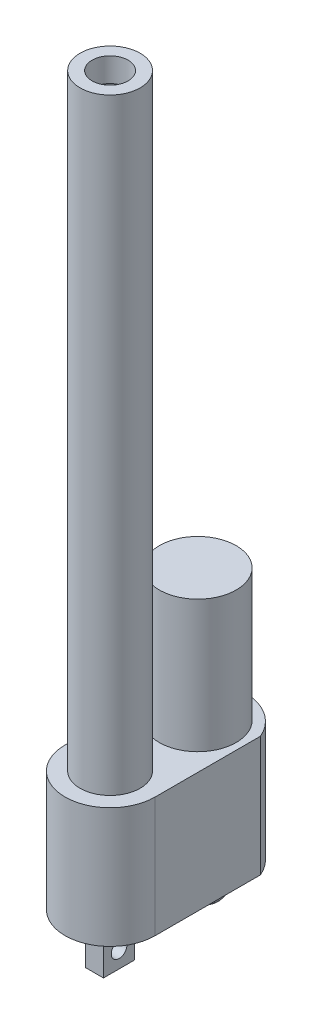
ISO-10303-21;
HEADER;
FILE_DESCRIPTION(('STEP AP214'),'2;1');
FILE_NAME('part.step','',(''),(''),'','','');
FILE_SCHEMA(('AUTOMOTIVE_DESIGN { 1 0 10303 214 1 1 1 1 }'));
ENDSEC;
DATA;
#1=APPLICATION_CONTEXT('core data for automotive mechanical design processes');
#2=APPLICATION_PROTOCOL_DEFINITION('international standard','automotive_design',2000,#1);
#3=PRODUCT_CONTEXT('',#1,'mechanical');
#4=PRODUCT('Part','Part','',(#3));
#5=PRODUCT_RELATED_PRODUCT_CATEGORY('part','',(#4));
#6=PRODUCT_DEFINITION_FORMATION('','',#4);
#7=PRODUCT_DEFINITION_CONTEXT('part definition',#1,'design');
#8=PRODUCT_DEFINITION('design','',#6,#7);
#9=PRODUCT_DEFINITION_SHAPE('','',#8);
#10=(LENGTH_UNIT() NAMED_UNIT(*) SI_UNIT(.MILLI.,.METRE.));
#11=(NAMED_UNIT(*) PLANE_ANGLE_UNIT() SI_UNIT($,.RADIAN.));
#12=(NAMED_UNIT(*) SI_UNIT($,.STERADIAN.) SOLID_ANGLE_UNIT());
#13=UNCERTAINTY_MEASURE_WITH_UNIT(LENGTH_MEASURE(1.E-05),#10,'distance_accuracy_value','');
#14=(GEOMETRIC_REPRESENTATION_CONTEXT(3) GLOBAL_UNCERTAINTY_ASSIGNED_CONTEXT((#13)) GLOBAL_UNIT_ASSIGNED_CONTEXT((#10,
#11,#12)) REPRESENTATION_CONTEXT('',''));
#15=CARTESIAN_POINT('',(0.,0.,0.));
#16=DIRECTION('',(0.,0.,1.));
#17=DIRECTION('',(1.,0.,0.));
#18=AXIS2_PLACEMENT_3D('',#15,#16,#17);
#19=CARTESIAN_POINT('',(0.,505.,0.));
#20=DIRECTION('',(0.,1.,0.));
#21=DIRECTION('',(1.,0.,0.));
#22=AXIS2_PLACEMENT_3D('',#19,#20,#21);
#23=PLANE('',#22);
#24=CARTESIAN_POINT('',(0.,505.,0.));
#25=DIRECTION('',(0.,-1.,0.));
#26=DIRECTION('',(-1.,0.,0.));
#27=AXIS2_PLACEMENT_3D('',#24,#25,#26);
#28=CIRCLE('',#27,15.);
#29=CARTESIAN_POINT('',(15.,505.,0.));
#30=VERTEX_POINT('',#29);
#31=EDGE_CURVE('E284',#30,#30,#28,.T.);
#32=ORIENTED_EDGE('',*,*,#31,.T.);
#33=EDGE_LOOP('',(#32));
#34=FACE_BOUND('',#33,.T.);
#35=CARTESIAN_POINT('',(0.,505.,0.));
#36=DIRECTION('',(0.,1.,0.));
#37=DIRECTION('',(-1.,0.,0.));
#38=AXIS2_PLACEMENT_3D('',#35,#36,#37);
#39=CIRCLE('',#38,25.);
#40=CARTESIAN_POINT('',(25.,505.,0.));
#41=VERTEX_POINT('',#40);
#42=EDGE_CURVE('E28',#41,#41,#39,.T.);
#43=ORIENTED_EDGE('',*,*,#42,.T.);
#44=EDGE_LOOP('',(#43));
#45=FACE_BOUND('',#44,.T.);
#46=ADVANCED_FACE('F17',(#34,#45),#23,.T.);
#47=CARTESIAN_POINT('',(0.,0.,0.));
#48=DIRECTION('',(0.,1.,0.));
#49=DIRECTION('',(-1.,0.,0.));
#50=AXIS2_PLACEMENT_3D('',#47,#48,#49);
#51=CYLINDRICAL_SURFACE('',#50,25.);
#52=ORIENTED_EDGE('',*,*,#42,.F.);
#53=DIRECTION('',(0.,-1.,0.));
#54=VECTOR('',#53,1.);
#55=CARTESIAN_POINT('',(25.,0.,0.));
#56=LINE('',#55,#54);
#57=CARTESIAN_POINT('',(25.,0.,0.));
#58=VERTEX_POINT('',#57);
#59=EDGE_CURVE('E11',#41,#58,#56,.T.);
#60=ORIENTED_EDGE('',*,*,#59,.T.);
#61=CARTESIAN_POINT('',(0.,0.,0.));
#62=DIRECTION('',(0.,1.,0.));
#63=DIRECTION('',(-1.,0.,0.));
#64=AXIS2_PLACEMENT_3D('',#61,#62,#63);
#65=CIRCLE('',#64,25.);
#66=EDGE_CURVE('E227',#58,#58,#65,.T.);
#67=ORIENTED_EDGE('',*,*,#66,.T.);
#68=ORIENTED_EDGE('',*,*,#59,.F.);
#69=EDGE_LOOP('',(#52,#60,#67,#68));
#70=FACE_BOUND('',#69,.T.);
#71=ADVANCED_FACE('F654',(#70),#51,.T.);
#72=CARTESIAN_POINT('',(0.,0.,0.));
#73=DIRECTION('',(0.,1.,0.));
#74=DIRECTION('',(-1.,0.,0.));
#75=AXIS2_PLACEMENT_3D('',#72,#73,#74);
#76=CYLINDRICAL_SURFACE('',#75,20.);
#77=CARTESIAN_POINT('',(0.,0.,0.));
#78=DIRECTION('',(0.,1.,0.));
#79=DIRECTION('',(-1.,0.,0.));
#80=AXIS2_PLACEMENT_3D('',#77,#78,#79);
#81=CIRCLE('',#80,20.);
#82=CARTESIAN_POINT('',(20.,0.,0.));
#83=VERTEX_POINT('',#82);
#84=EDGE_CURVE('E221',#83,#83,#81,.T.);
#85=ORIENTED_EDGE('',*,*,#84,.F.);
#86=DIRECTION('',(0.,1.,0.));
#87=VECTOR('',#86,1.);
#88=CARTESIAN_POINT('',(20.,0.,0.));
#89=LINE('',#88,#87);
#90=CARTESIAN_POINT('',(20.,485.,0.));
#91=VERTEX_POINT('',#90);
#92=EDGE_CURVE('E204',#83,#91,#89,.T.);
#93=ORIENTED_EDGE('',*,*,#92,.T.);
#94=CARTESIAN_POINT('',(0.,485.,0.));
#95=DIRECTION('',(0.,1.,0.));
#96=DIRECTION('',(-1.,0.,0.));
#97=AXIS2_PLACEMENT_3D('',#94,#95,#96);
#98=CIRCLE('',#97,20.);
#99=EDGE_CURVE('E267',#91,#91,#98,.T.);
#100=ORIENTED_EDGE('',*,*,#99,.T.);
#101=ORIENTED_EDGE('',*,*,#92,.F.);
#102=EDGE_LOOP('',(#85,#93,#100,#101));
#103=FACE_BOUND('',#102,.T.);
#104=ADVANCED_FACE('F684',(#103),#76,.F.);
#105=CARTESIAN_POINT('',(0.,-100.,-37.5));
#106=DIRECTION('',(0.,-1.,0.));
#107=DIRECTION('',(0.,0.,-1.));
#108=AXIS2_PLACEMENT_3D('',#105,#106,#107);
#109=PLANE('',#108);
#110=CARTESIAN_POINT('',(0.,-100.,0.));
#111=DIRECTION('',(0.,1.,0.));
#112=DIRECTION('',(1.,0.,0.));
#113=AXIS2_PLACEMENT_3D('',#110,#111,#112);
#114=CIRCLE('',#113,15.);
#115=CARTESIAN_POINT('',(-15.,-100.,0.));
#116=VERTEX_POINT('',#115);
#117=EDGE_CURVE('E247',#116,#116,#114,.T.);
#118=ORIENTED_EDGE('',*,*,#117,.T.);
#119=EDGE_LOOP('',(#118));
#120=FACE_BOUND('',#119,.T.);
#121=CARTESIAN_POINT('',(0.,-100.,-78.2205334953049));
#122=DIRECTION('',(0.,1.,0.));
#123=DIRECTION('',(1.,0.,0.));
#124=AXIS2_PLACEMENT_3D('',#121,#122,#123);
#125=CIRCLE('',#124,15.);
#126=CARTESIAN_POINT('',(-15.,-100.,-78.2205334953049));
#127=VERTEX_POINT('',#126);
#128=EDGE_CURVE('E301',#127,#127,#125,.T.);
#129=ORIENTED_EDGE('',*,*,#128,.T.);
#130=EDGE_LOOP('',(#129));
#131=FACE_BOUND('',#130,.T.);
#132=CARTESIAN_POINT('',(0.,-100.,0.));
#133=DIRECTION('',(0.,-1.,0.));
#134=DIRECTION('',(1.,0.,0.));
#135=AXIS2_PLACEMENT_3D('',#132,#133,#134);
#136=CIRCLE('',#135,37.5);
#137=CARTESIAN_POINT('',(37.5,-100.,0.));
#138=VERTEX_POINT('',#137);
#139=CARTESIAN_POINT('',(-37.5,-100.,0.));
#140=VERTEX_POINT('',#139);
#141=EDGE_CURVE('E192',#138,#140,#136,.T.);
#142=ORIENTED_EDGE('',*,*,#141,.T.);
#143=DIRECTION('',(0.,0.,-1.));
#144=VECTOR('',#143,1.);
#145=CARTESIAN_POINT('',(-37.5,-100.,0.));
#146=LINE('',#145,#144);
#147=CARTESIAN_POINT('',(-37.5,-100.,-87.6893129809068));
#148=VERTEX_POINT('',#147);
#149=EDGE_CURVE('E324',#140,#148,#146,.T.);
#150=ORIENTED_EDGE('',*,*,#149,.T.);
#151=CARTESIAN_POINT('',(0.,-100.,-71.7550543077768));
#152=DIRECTION('',(0.,-1.,0.));
#153=DIRECTION('',(-0.920359552894371,0.,-0.391073258349474));
#154=AXIS2_PLACEMENT_3D('',#151,#152,#153);
#155=CIRCLE('',#154,40.7449456922232);
#156=CARTESIAN_POINT('',(37.5,-100.,-87.6893129809068));
#157=VERTEX_POINT('',#156);
#158=EDGE_CURVE('E210',#148,#157,#155,.T.);
#159=ORIENTED_EDGE('',*,*,#158,.T.);
#160=DIRECTION('',(0.,0.,1.));
#161=VECTOR('',#160,1.);
#162=CARTESIAN_POINT('',(37.5,-100.,-87.6893129809068));
#163=LINE('',#162,#161);
#164=EDGE_CURVE('E207',#157,#138,#163,.T.);
#165=ORIENTED_EDGE('',*,*,#164,.T.);
#166=EDGE_LOOP('',(#142,#150,#159,#165));
#167=FACE_BOUND('',#166,.T.);
#168=ADVANCED_FACE('F208',(#120,#131,#167),#109,.T.);
#169=CARTESIAN_POINT('',(0.,0.,0.));
#170=DIRECTION('',(0.,-1.,0.));
#171=DIRECTION('',(1.,0.,0.));
#172=AXIS2_PLACEMENT_3D('',#169,#170,#171);
#173=CYLINDRICAL_SURFACE('',#172,37.5);
#174=CARTESIAN_POINT('',(0.,0.,0.));
#175=DIRECTION('',(0.,-1.,0.));
#176=DIRECTION('',(1.,0.,0.));
#177=AXIS2_PLACEMENT_3D('',#174,#175,#176);
#178=CIRCLE('',#177,37.5);
#179=CARTESIAN_POINT('',(37.5,0.,0.));
#180=VERTEX_POINT('',#179);
#181=CARTESIAN_POINT('',(-37.5,0.,0.));
#182=VERTEX_POINT('',#181);
#183=EDGE_CURVE('E256',#180,#182,#178,.T.);
#184=ORIENTED_EDGE('',*,*,#183,.T.);
#185=DIRECTION('',(0.,-1.,0.));
#186=VECTOR('',#185,1.);
#187=CARTESIAN_POINT('',(-37.5,0.,0.));
#188=LINE('',#187,#186);
#189=EDGE_CURVE('E199',#182,#140,#188,.T.);
#190=ORIENTED_EDGE('',*,*,#189,.T.);
#191=ORIENTED_EDGE('',*,*,#141,.F.);
#192=DIRECTION('',(0.,-1.,0.));
#193=VECTOR('',#192,1.);
#194=CARTESIAN_POINT('',(37.5,0.,0.));
#195=LINE('',#194,#193);
#196=EDGE_CURVE('E197',#180,#138,#195,.T.);
#197=ORIENTED_EDGE('',*,*,#196,.F.);
#198=EDGE_LOOP('',(#184,#190,#191,#197));
#199=FACE_BOUND('',#198,.T.);
#200=ADVANCED_FACE('F195',(#199),#173,.T.);
#201=CARTESIAN_POINT('',(-37.5,0.,0.));
#202=DIRECTION('',(-1.,0.,0.));
#203=DIRECTION('',(0.,0.,1.));
#204=AXIS2_PLACEMENT_3D('',#201,#202,#203);
#205=PLANE('',#204);
#206=DIRECTION('',(0.,0.,-1.));
#207=VECTOR('',#206,1.);
#208=CARTESIAN_POINT('',(-37.5,0.,0.));
#209=LINE('',#208,#207);
#210=CARTESIAN_POINT('',(-37.5,0.,-87.6893129809068));
#211=VERTEX_POINT('',#210);
#212=EDGE_CURVE('E275',#182,#211,#209,.T.);
#213=ORIENTED_EDGE('',*,*,#212,.T.);
#214=DIRECTION('',(0.,-1.,0.));
#215=VECTOR('',#214,1.);
#216=CARTESIAN_POINT('',(-37.5,0.,-87.6893129809068));
#217=LINE('',#216,#215);
#218=EDGE_CURVE('E320',#211,#148,#217,.T.);
#219=ORIENTED_EDGE('',*,*,#218,.T.);
#220=ORIENTED_EDGE('',*,*,#149,.F.);
#221=ORIENTED_EDGE('',*,*,#189,.F.);
#222=EDGE_LOOP('',(#213,#219,#220,#221));
#223=FACE_BOUND('',#222,.T.);
#224=ADVANCED_FACE('F664',(#223),#205,.T.);
#225=CARTESIAN_POINT('',(0.,0.,-71.7550543077768));
#226=DIRECTION('',(0.,-1.,0.));
#227=DIRECTION('',(-0.920359552894371,0.,-0.391073258349474));
#228=AXIS2_PLACEMENT_3D('',#225,#226,#227);
#229=CYLINDRICAL_SURFACE('',#228,40.7449456922232);
#230=CARTESIAN_POINT('',(0.,0.,-71.7550543077768));
#231=DIRECTION('',(0.,-1.,0.));
#232=DIRECTION('',(-0.920359552894371,0.,-0.391073258349474));
#233=AXIS2_PLACEMENT_3D('',#230,#231,#232);
#234=CIRCLE('',#233,40.7449456922232);
#235=CARTESIAN_POINT('',(37.5,0.,-87.6893129809068));
#236=VERTEX_POINT('',#235);
#237=EDGE_CURVE('E279',#211,#236,#234,.T.);
#238=ORIENTED_EDGE('',*,*,#237,.T.);
#239=DIRECTION('',(0.,-1.,0.));
#240=VECTOR('',#239,1.);
#241=CARTESIAN_POINT('',(37.5,0.,-87.6893129809068));
#242=LINE('',#241,#240);
#243=EDGE_CURVE('E214',#236,#157,#242,.T.);
#244=ORIENTED_EDGE('',*,*,#243,.T.);
#245=ORIENTED_EDGE('',*,*,#158,.F.);
#246=ORIENTED_EDGE('',*,*,#218,.F.);
#247=EDGE_LOOP('',(#238,#244,#245,#246));
#248=FACE_BOUND('',#247,.T.);
#249=ADVANCED_FACE('F667',(#248),#229,.T.);
#250=CARTESIAN_POINT('',(37.5,0.,-87.6893129809068));
#251=DIRECTION('',(1.,0.,0.));
#252=DIRECTION('',(0.,1.,0.));
#253=AXIS2_PLACEMENT_3D('',#250,#251,#252);
#254=PLANE('',#253);
#255=DIRECTION('',(0.,0.,1.));
#256=VECTOR('',#255,1.);
#257=CARTESIAN_POINT('',(37.5,0.,-87.6893129809068));
#258=LINE('',#257,#256);
#259=EDGE_CURVE('E218',#236,#180,#258,.T.);
#260=ORIENTED_EDGE('',*,*,#259,.T.);
#261=ORIENTED_EDGE('',*,*,#196,.T.);
#262=ORIENTED_EDGE('',*,*,#164,.F.);
#263=ORIENTED_EDGE('',*,*,#243,.F.);
#264=EDGE_LOOP('',(#260,#261,#262,#263));
#265=FACE_BOUND('',#264,.T.);
#266=ADVANCED_FACE('F216',(#265),#254,.T.);
#267=CARTESIAN_POINT('',(0.,0.,-37.5));
#268=DIRECTION('',(0.,-1.,0.));
#269=DIRECTION('',(0.,0.,-1.));
#270=AXIS2_PLACEMENT_3D('',#267,#268,#269);
#271=PLANE('',#270);
#272=ORIENTED_EDGE('',*,*,#84,.T.);
#273=EDGE_LOOP('',(#272));
#274=FACE_BOUND('',#273,.T.);
#275=ADVANCED_FACE('F659',(#274),#271,.F.);
#276=CARTESIAN_POINT('',(0.,0.,-37.5));
#277=DIRECTION('',(0.,-1.,0.));
#278=DIRECTION('',(0.,0.,-1.));
#279=AXIS2_PLACEMENT_3D('',#276,#277,#278);
#280=PLANE('',#279);
#281=ORIENTED_EDGE('',*,*,#66,.F.);
#282=EDGE_LOOP('',(#281));
#283=FACE_BOUND('',#282,.T.);
#284=CARTESIAN_POINT('',(0.,0.,-72.9769138079016));
#285=DIRECTION('',(0.,-1.,0.));
#286=DIRECTION('',(1.,0.,0.));
#287=AXIS2_PLACEMENT_3D('',#284,#285,#286);
#288=CIRCLE('',#287,32.);
#289=CARTESIAN_POINT('',(-32.,0.,-72.9769138079016));
#290=VERTEX_POINT('',#289);
#291=EDGE_CURVE('E142',#290,#290,#288,.T.);
#292=ORIENTED_EDGE('',*,*,#291,.T.);
#293=EDGE_LOOP('',(#292));
#294=FACE_BOUND('',#293,.T.);
#295=ORIENTED_EDGE('',*,*,#183,.F.);
#296=ORIENTED_EDGE('',*,*,#259,.F.);
#297=ORIENTED_EDGE('',*,*,#237,.F.);
#298=ORIENTED_EDGE('',*,*,#212,.F.);
#299=EDGE_LOOP('',(#295,#296,#297,#298));
#300=FACE_BOUND('',#299,.T.);
#301=ADVANCED_FACE('F19',(#283,#294,#300),#280,.F.);
#302=CARTESIAN_POINT('',(0.,110.,-72.9769138079016));
#303=DIRECTION('',(0.,1.,0.));
#304=DIRECTION('',(1.,0.,0.));
#305=AXIS2_PLACEMENT_3D('',#302,#303,#304);
#306=PLANE('',#305);
#307=CARTESIAN_POINT('',(0.,110.,-72.9769138079016));
#308=DIRECTION('',(0.,1.,0.));
#309=DIRECTION('',(1.,0.,0.));
#310=AXIS2_PLACEMENT_3D('',#307,#308,#309);
#311=CIRCLE('',#310,32.);
#312=CARTESIAN_POINT('',(-32.,110.,-72.9769138079016));
#313=VERTEX_POINT('',#312);
#314=EDGE_CURVE('E250',#313,#313,#311,.T.);
#315=ORIENTED_EDGE('',*,*,#314,.T.);
#316=EDGE_LOOP('',(#315));
#317=FACE_BOUND('',#316,.T.);
#318=ADVANCED_FACE('F658',(#317),#306,.T.);
#319=CARTESIAN_POINT('',(0.,0.,-72.9769138079016));
#320=DIRECTION('',(0.,1.,0.));
#321=DIRECTION('',(1.,0.,0.));
#322=AXIS2_PLACEMENT_3D('',#319,#320,#321);
#323=CYLINDRICAL_SURFACE('',#322,32.);
#324=ORIENTED_EDGE('',*,*,#314,.F.);
#325=DIRECTION('',(0.,-1.,0.));
#326=VECTOR('',#325,1.);
#327=CARTESIAN_POINT('',(-32.,0.,-72.9769138079016));
#328=LINE('',#327,#326);
#329=EDGE_CURVE('E133',#313,#290,#328,.T.);
#330=ORIENTED_EDGE('',*,*,#329,.T.);
#331=ORIENTED_EDGE('',*,*,#291,.F.);
#332=ORIENTED_EDGE('',*,*,#329,.F.);
#333=EDGE_LOOP('',(#324,#330,#331,#332));
#334=FACE_BOUND('',#333,.T.);
#335=ADVANCED_FACE('F707',(#334),#323,.T.);
#336=CARTESIAN_POINT('',(0.,-100.,0.));
#337=DIRECTION('',(0.,-1.,0.));
#338=DIRECTION('',(1.,0.,0.));
#339=AXIS2_PLACEMENT_3D('',#336,#337,#338);
#340=CYLINDRICAL_SURFACE('',#339,15.);
#341=CARTESIAN_POINT('',(0.,-105.,0.));
#342=DIRECTION('',(0.,-1.,0.));
#343=DIRECTION('',(1.,0.,0.));
#344=AXIS2_PLACEMENT_3D('',#341,#342,#343);
#345=CIRCLE('',#344,15.);
#346=CARTESIAN_POINT('',(7.48331477354788,-105.,-13.));
#347=VERTEX_POINT('',#346);
#348=CARTESIAN_POINT('',(7.48331477354788,-105.,13.));
#349=VERTEX_POINT('',#348);
#350=EDGE_CURVE('E255',#347,#349,#345,.T.);
#351=ORIENTED_EDGE('',*,*,#350,.F.);
#352=CARTESIAN_POINT('',(0.,-105.,0.));
#353=DIRECTION('',(0.,-1.,0.));
#354=DIRECTION('',(1.,0.,0.));
#355=AXIS2_PLACEMENT_3D('',#352,#353,#354);
#356=CIRCLE('',#355,15.);
#357=CARTESIAN_POINT('',(-7.48331477354788,-105.,-13.));
#358=VERTEX_POINT('',#357);
#359=EDGE_CURVE('E252',#358,#347,#356,.T.);
#360=ORIENTED_EDGE('',*,*,#359,.F.);
#361=CARTESIAN_POINT('',(0.,-105.,0.));
#362=DIRECTION('',(0.,-1.,0.));
#363=DIRECTION('',(1.,0.,0.));
#364=AXIS2_PLACEMENT_3D('',#361,#362,#363);
#365=CIRCLE('',#364,15.);
#366=CARTESIAN_POINT('',(-15.,-105.,0.));
#367=VERTEX_POINT('',#366);
#368=EDGE_CURVE('E233',#367,#358,#365,.T.);
#369=ORIENTED_EDGE('',*,*,#368,.F.);
#370=DIRECTION('',(0.,1.,0.));
#371=VECTOR('',#370,1.);
#372=CARTESIAN_POINT('',(-15.,-100.,0.));
#373=LINE('',#372,#371);
#374=EDGE_CURVE('E251',#367,#116,#373,.T.);
#375=ORIENTED_EDGE('',*,*,#374,.T.);
#376=ORIENTED_EDGE('',*,*,#117,.F.);
#377=ORIENTED_EDGE('',*,*,#374,.F.);
#378=CARTESIAN_POINT('',(0.,-105.,0.));
#379=DIRECTION('',(0.,-1.,0.));
#380=DIRECTION('',(1.,0.,0.));
#381=AXIS2_PLACEMENT_3D('',#378,#379,#380);
#382=CIRCLE('',#381,15.);
#383=CARTESIAN_POINT('',(-7.48331477354788,-105.,13.));
#384=VERTEX_POINT('',#383);
#385=EDGE_CURVE('E236',#384,#367,#382,.T.);
#386=ORIENTED_EDGE('',*,*,#385,.F.);
#387=CARTESIAN_POINT('',(0.,-105.,0.));
#388=DIRECTION('',(0.,-1.,0.));
#389=DIRECTION('',(1.,0.,0.));
#390=AXIS2_PLACEMENT_3D('',#387,#388,#389);
#391=CIRCLE('',#390,15.);
#392=EDGE_CURVE('E268',#349,#384,#391,.T.);
#393=ORIENTED_EDGE('',*,*,#392,.F.);
#394=EDGE_LOOP('',(#351,#360,#369,#375,#376,#377,#386,#393));
#395=FACE_BOUND('',#394,.T.);
#396=ADVANCED_FACE('F710',(#395),#340,.T.);
#397=CARTESIAN_POINT('',(0.,-130.,-78.2205334953049));
#398=DIRECTION('',(0.,-1.,0.));
#399=DIRECTION('',(0.,0.,-1.));
#400=AXIS2_PLACEMENT_3D('',#397,#398,#399);
#401=PLANE('',#400);
#402=CARTESIAN_POINT('',(0.,-130.,-78.2205334953049));
#403=DIRECTION('',(0.,1.,0.));
#404=DIRECTION('',(-1.,0.,0.));
#405=AXIS2_PLACEMENT_3D('',#402,#403,#404);
#406=CIRCLE('',#405,5.);
#407=CARTESIAN_POINT('',(0.,-130.,-73.2205334953049));
#408=VERTEX_POINT('',#407);
#409=EDGE_CURVE('E230',#408,#408,#406,.T.);
#410=ORIENTED_EDGE('',*,*,#409,.F.);
#411=EDGE_LOOP('',(#410));
#412=FACE_BOUND('',#411,.T.);
#413=ADVANCED_FACE('F737',(#412),#401,.T.);
#414=CARTESIAN_POINT('',(0.,-100.,-78.2205334953049));
#415=DIRECTION('',(0.,-1.,0.));
#416=DIRECTION('',(1.,0.,0.));
#417=AXIS2_PLACEMENT_3D('',#414,#415,#416);
#418=CYLINDRICAL_SURFACE('',#417,15.);
#419=CARTESIAN_POINT('',(0.,-120.,-78.2205334953049));
#420=DIRECTION('',(0.,-1.,0.));
#421=DIRECTION('',(-1.,0.,0.));
#422=AXIS2_PLACEMENT_3D('',#419,#420,#421);
#423=CIRCLE('',#422,15.);
#424=CARTESIAN_POINT('',(-15.,-120.,-78.2205334953049));
#425=VERTEX_POINT('',#424);
#426=CARTESIAN_POINT('',(0.,-120.,-63.2205334953049));
#427=VERTEX_POINT('',#426);
#428=EDGE_CURVE('E242',#425,#427,#423,.T.);
#429=ORIENTED_EDGE('',*,*,#428,.F.);
#430=DIRECTION('',(0.,1.,0.));
#431=VECTOR('',#430,1.);
#432=CARTESIAN_POINT('',(-15.,-100.,-78.2205334953049));
#433=LINE('',#432,#431);
#434=EDGE_CURVE('E245',#425,#127,#433,.T.);
#435=ORIENTED_EDGE('',*,*,#434,.T.);
#436=ORIENTED_EDGE('',*,*,#128,.F.);
#437=ORIENTED_EDGE('',*,*,#434,.F.);
#438=CARTESIAN_POINT('',(0.,-120.,-78.2205334953049));
#439=DIRECTION('',(0.,-1.,0.));
#440=DIRECTION('',(-1.,0.,0.));
#441=AXIS2_PLACEMENT_3D('',#438,#439,#440);
#442=CIRCLE('',#441,15.);
#443=EDGE_CURVE('E246',#427,#425,#442,.T.);
#444=ORIENTED_EDGE('',*,*,#443,.F.);
#445=EDGE_LOOP('',(#429,#435,#436,#437,#444));
#446=FACE_BOUND('',#445,.T.);
#447=ADVANCED_FACE('F728',(#446),#418,.T.);
#448=CARTESIAN_POINT('',(0.,-120.,-63.2205334953049));
#449=CARTESIAN_POINT('',(-15.,-120.,-63.2205334953049));
#450=CARTESIAN_POINT('',(-15.,-120.,-78.2205334953049));
#451=CARTESIAN_POINT('',(-15.,-120.,-93.2205334953049));
#452=CARTESIAN_POINT('',(0.,-120.,-93.2205334953049));
#453=CARTESIAN_POINT('',(15.,-120.,-93.2205334953049));
#454=CARTESIAN_POINT('',(15.,-120.,-78.2205334953049));
#455=CARTESIAN_POINT('',(15.,-120.,-63.2205334953049));
#456=CARTESIAN_POINT('',(0.,-120.,-63.2205334953049));
#457=CARTESIAN_POINT('',(0.,-130.,-63.2205334953049));
#458=CARTESIAN_POINT('',(-15.,-130.,-63.2205334953052));
#459=CARTESIAN_POINT('',(-15.,-130.,-78.2205334953049));
#460=CARTESIAN_POINT('',(-15.,-130.,-93.2205334953052));
#461=CARTESIAN_POINT('',(0.,-130.,-93.2205334953049));
#462=CARTESIAN_POINT('',(15.,-130.,-93.2205334953052));
#463=CARTESIAN_POINT('',(15.,-130.,-78.2205334953049));
#464=CARTESIAN_POINT('',(15.,-130.,-63.2205334953052));
#465=CARTESIAN_POINT('',(0.,-130.,-63.2205334953049));
#466=CARTESIAN_POINT('',(0.,-130.,-73.2205334953049));
#467=CARTESIAN_POINT('',(-5.,-130.,-73.2205334953049));
#468=CARTESIAN_POINT('',(-5.,-130.,-78.2205334953049));
#469=CARTESIAN_POINT('',(-5.,-130.,-83.220533495305));
#470=CARTESIAN_POINT('',(0.,-130.,-83.2205334953049));
#471=CARTESIAN_POINT('',(5.,-130.,-83.220533495305));
#472=CARTESIAN_POINT('',(5.,-130.,-78.2205334953049));
#473=CARTESIAN_POINT('',(5.,-130.,-73.2205334953049));
#474=CARTESIAN_POINT('',(0.,-130.,-73.2205334953049));
#475=(BOUNDED_SURFACE() B_SPLINE_SURFACE(2,2,((#448,#449,#450,#451,#452,#453,#454,#455,#456),
(#457,#458,#459,#460,#461,#462,#463,#464,#465),(#466,#467,#468,#469,#470,#471,#472,#473,#474)),
.UNSPECIFIED.,.F.,.T.,.F.) B_SPLINE_SURFACE_WITH_KNOTS((3,3),(3,2,2,2,3),(0.,1.5707963267949),
(-3.14159265358979,-1.5707963267949,0.,1.5707963267949,3.14159265358979),
.UNSPECIFIED.) GEOMETRIC_REPRESENTATION_ITEM() RATIONAL_B_SPLINE_SURFACE(((1.,0.707106781186548,
1.,0.707106781186548,1.,0.707106781186548,1.,0.707106781186548,1.),(0.70710678118655,0.5,
0.70710678118655,0.5,0.70710678118655,0.5,0.70710678118655,0.5,0.70710678118655),(1.,
0.707106781186548,1.,0.707106781186548,1.,0.707106781186548,1.,0.707106781186548,1.))) REPRESENTATION_ITEM('') SURFACE());
#476=CARTESIAN_POINT('',(0.,-120.,-73.2205334953049));
#477=DIRECTION('',(-1.,0.,0.));
#478=DIRECTION('',(0.,0.,1.));
#479=AXIS2_PLACEMENT_3D('',#476,#477,#478);
#480=CIRCLE('',#479,10.);
#481=EDGE_CURVE('E325',#408,#427,#480,.T.);
#482=ORIENTED_EDGE('',*,*,#409,.T.);
#483=ORIENTED_EDGE('',*,*,#481,.T.);
#484=ORIENTED_EDGE('',*,*,#443,.T.);
#485=ORIENTED_EDGE('',*,*,#428,.T.);
#486=ORIENTED_EDGE('',*,*,#481,.F.);
#487=EDGE_LOOP('',(#482,#483,#484,#485,#486));
#488=FACE_BOUND('',#487,.T.);
#489=ADVANCED_FACE('F694',(#488),#475,.F.);
#490=CARTESIAN_POINT('',(0.,-105.,0.));
#491=DIRECTION('',(0.,-1.,0.));
#492=DIRECTION('',(0.,0.,-1.));
#493=AXIS2_PLACEMENT_3D('',#490,#491,#492);
#494=PLANE('',#493);
#495=DIRECTION('',(0.,0.,1.));
#496=VECTOR('',#495,1.);
#497=CARTESIAN_POINT('',(-7.48331477354788,-105.,6.5));
#498=LINE('',#497,#496);
#499=EDGE_CURVE('E293',#358,#384,#498,.T.);
#500=ORIENTED_EDGE('',*,*,#499,.T.);
#501=ORIENTED_EDGE('',*,*,#385,.T.);
#502=ORIENTED_EDGE('',*,*,#368,.T.);
#503=EDGE_LOOP('',(#500,#501,#502));
#504=FACE_BOUND('',#503,.T.);
#505=ADVANCED_FACE('F690',(#504),#494,.T.);
#506=CARTESIAN_POINT('',(0.,-105.,0.));
#507=DIRECTION('',(0.,-1.,0.));
#508=DIRECTION('',(0.,0.,-1.));
#509=AXIS2_PLACEMENT_3D('',#506,#507,#508);
#510=PLANE('',#509);
#511=DIRECTION('',(-1.,0.,0.));
#512=VECTOR('',#511,1.);
#513=CARTESIAN_POINT('',(-3.74165738677394,-105.,-13.));
#514=LINE('',#513,#512);
#515=EDGE_CURVE('E292',#347,#358,#514,.T.);
#516=ORIENTED_EDGE('',*,*,#515,.T.);
#517=ORIENTED_EDGE('',*,*,#359,.T.);
#518=EDGE_LOOP('',(#516,#517));
#519=FACE_BOUND('',#518,.T.);
#520=ADVANCED_FACE('F693',(#519),#510,.T.);
#521=CARTESIAN_POINT('',(0.,-105.,0.));
#522=DIRECTION('',(0.,-1.,0.));
#523=DIRECTION('',(0.,0.,-1.));
#524=AXIS2_PLACEMENT_3D('',#521,#522,#523);
#525=PLANE('',#524);
#526=DIRECTION('',(0.,0.,-1.));
#527=VECTOR('',#526,1.);
#528=CARTESIAN_POINT('',(7.48331477354788,-105.,-6.5));
#529=LINE('',#528,#527);
#530=EDGE_CURVE('E263',#349,#347,#529,.T.);
#531=ORIENTED_EDGE('',*,*,#530,.T.);
#532=ORIENTED_EDGE('',*,*,#350,.T.);
#533=EDGE_LOOP('',(#531,#532));
#534=FACE_BOUND('',#533,.T.);
#535=ADVANCED_FACE('F706',(#534),#525,.T.);
#536=CARTESIAN_POINT('',(0.,-105.,0.));
#537=DIRECTION('',(0.,-1.,0.));
#538=DIRECTION('',(0.,0.,-1.));
#539=AXIS2_PLACEMENT_3D('',#536,#537,#538);
#540=PLANE('',#539);
#541=DIRECTION('',(1.,0.,0.));
#542=VECTOR('',#541,1.);
#543=CARTESIAN_POINT('',(3.74165738677394,-105.,13.));
#544=LINE('',#543,#542);
#545=EDGE_CURVE('E21',#384,#349,#544,.T.);
#546=ORIENTED_EDGE('',*,*,#545,.T.);
#547=ORIENTED_EDGE('',*,*,#392,.T.);
#548=EDGE_LOOP('',(#546,#547));
#549=FACE_BOUND('',#548,.T.);
#550=ADVANCED_FACE('F703',(#549),#540,.T.);
#551=CARTESIAN_POINT('',(0.,-139.,0.));
#552=DIRECTION('',(0.,-1.,0.));
#553=DIRECTION('',(0.,0.,-1.));
#554=AXIS2_PLACEMENT_3D('',#551,#552,#553);
#555=PLANE('',#554);
#556=DIRECTION('',(0.,0.,-1.));
#557=VECTOR('',#556,1.);
#558=CARTESIAN_POINT('',(-7.48331477354788,-139.,13.));
#559=LINE('',#558,#557);
#560=CARTESIAN_POINT('',(-7.48331477354788,-139.,13.));
#561=VERTEX_POINT('',#560);
#562=CARTESIAN_POINT('',(-7.48331477354788,-139.,-13.));
#563=VERTEX_POINT('',#562);
#564=EDGE_CURVE('E175',#561,#563,#559,.T.);
#565=ORIENTED_EDGE('',*,*,#564,.T.);
#566=DIRECTION('',(1.,0.,0.));
#567=VECTOR('',#566,1.);
#568=CARTESIAN_POINT('',(-7.48331477354788,-139.,-13.));
#569=LINE('',#568,#567);
#570=CARTESIAN_POINT('',(7.48331477354788,-139.,-13.));
#571=VERTEX_POINT('',#570);
#572=EDGE_CURVE('E362',#563,#571,#569,.T.);
#573=ORIENTED_EDGE('',*,*,#572,.T.);
#574=DIRECTION('',(0.,0.,1.));
#575=VECTOR('',#574,1.);
#576=CARTESIAN_POINT('',(7.48331477354788,-139.,-13.));
#577=LINE('',#576,#575);
#578=CARTESIAN_POINT('',(7.48331477354788,-139.,13.));
#579=VERTEX_POINT('',#578);
#580=EDGE_CURVE('E184',#571,#579,#577,.T.);
#581=ORIENTED_EDGE('',*,*,#580,.T.);
#582=DIRECTION('',(-1.,0.,0.));
#583=VECTOR('',#582,1.);
#584=CARTESIAN_POINT('',(7.48331477354788,-139.,13.));
#585=LINE('',#584,#583);
#586=EDGE_CURVE('E237',#579,#561,#585,.T.);
#587=ORIENTED_EDGE('',*,*,#586,.T.);
#588=EDGE_LOOP('',(#565,#573,#581,#587));
#589=FACE_BOUND('',#588,.T.);
#590=ADVANCED_FACE('F374',(#589),#555,.T.);
#591=CARTESIAN_POINT('',(-7.48331477354788,-105.,13.));
#592=DIRECTION('',(-1.,0.,0.));
#593=DIRECTION('',(0.,0.,1.));
#594=AXIS2_PLACEMENT_3D('',#591,#592,#593);
#595=PLANE('',#594);
#596=CARTESIAN_POINT('',(-7.48331477354788,-125.,0.));
#597=DIRECTION('',(1.,0.,0.));
#598=DIRECTION('',(0.,0.,-1.));
#599=AXIS2_PLACEMENT_3D('',#596,#597,#598);
#600=CIRCLE('',#599,6.5);
#601=CARTESIAN_POINT('',(-7.48331477354788,-125.,6.5));
#602=VERTEX_POINT('',#601);
#603=EDGE_CURVE('E107',#602,#602,#600,.T.);
#604=ORIENTED_EDGE('',*,*,#603,.T.);
#605=EDGE_LOOP('',(#604));
#606=FACE_BOUND('',#605,.T.);
#607=ORIENTED_EDGE('',*,*,#499,.F.);
#608=DIRECTION('',(0.,-1.,0.));
#609=VECTOR('',#608,1.);
#610=CARTESIAN_POINT('',(-7.48331477354788,-105.,-13.));
#611=LINE('',#610,#609);
#612=EDGE_CURVE('E297',#358,#563,#611,.T.);
#613=ORIENTED_EDGE('',*,*,#612,.T.);
#614=ORIENTED_EDGE('',*,*,#564,.F.);
#615=DIRECTION('',(0.,-1.,0.));
#616=VECTOR('',#615,1.);
#617=CARTESIAN_POINT('',(-7.48331477354788,-105.,13.));
#618=LINE('',#617,#616);
#619=EDGE_CURVE('E241',#384,#561,#618,.T.);
#620=ORIENTED_EDGE('',*,*,#619,.F.);
#621=EDGE_LOOP('',(#607,#613,#614,#620));
#622=FACE_BOUND('',#621,.T.);
#623=ADVANCED_FACE('F369',(#606,#622),#595,.T.);
#624=CARTESIAN_POINT('',(-7.48331477354788,-105.,-13.));
#625=DIRECTION('',(0.,0.,-1.));
#626=DIRECTION('',(0.,-1.,0.));
#627=AXIS2_PLACEMENT_3D('',#624,#625,#626);
#628=PLANE('',#627);
#629=ORIENTED_EDGE('',*,*,#515,.F.);
#630=DIRECTION('',(0.,-1.,0.));
#631=VECTOR('',#630,1.);
#632=CARTESIAN_POINT('',(7.48331477354788,-105.,-13.));
#633=LINE('',#632,#631);
#634=EDGE_CURVE('E288',#347,#571,#633,.T.);
#635=ORIENTED_EDGE('',*,*,#634,.T.);
#636=ORIENTED_EDGE('',*,*,#572,.F.);
#637=ORIENTED_EDGE('',*,*,#612,.F.);
#638=EDGE_LOOP('',(#629,#635,#636,#637));
#639=FACE_BOUND('',#638,.T.);
#640=ADVANCED_FACE('F372',(#639),#628,.T.);
#641=CARTESIAN_POINT('',(7.48331477354788,-105.,-13.));
#642=DIRECTION('',(1.,0.,0.));
#643=DIRECTION('',(0.,1.,0.));
#644=AXIS2_PLACEMENT_3D('',#641,#642,#643);
#645=PLANE('',#644);
#646=CARTESIAN_POINT('',(7.48331477354788,-125.,0.));
#647=DIRECTION('',(-1.,0.,0.));
#648=DIRECTION('',(0.,0.,-1.));
#649=AXIS2_PLACEMENT_3D('',#646,#647,#648);
#650=CIRCLE('',#649,6.5);
#651=CARTESIAN_POINT('',(7.48331477354788,-125.,6.5));
#652=VERTEX_POINT('',#651);
#653=EDGE_CURVE('E264',#652,#652,#650,.T.);
#654=ORIENTED_EDGE('',*,*,#653,.T.);
#655=EDGE_LOOP('',(#654));
#656=FACE_BOUND('',#655,.T.);
#657=ORIENTED_EDGE('',*,*,#530,.F.);
#658=DIRECTION('',(0.,-1.,0.));
#659=VECTOR('',#658,1.);
#660=CARTESIAN_POINT('',(7.48331477354788,-105.,13.));
#661=LINE('',#660,#659);
#662=EDGE_CURVE('E240',#349,#579,#661,.T.);
#663=ORIENTED_EDGE('',*,*,#662,.T.);
#664=ORIENTED_EDGE('',*,*,#580,.F.);
#665=ORIENTED_EDGE('',*,*,#634,.F.);
#666=EDGE_LOOP('',(#657,#663,#664,#665));
#667=FACE_BOUND('',#666,.T.);
#668=ADVANCED_FACE('F702',(#656,#667),#645,.T.);
#669=CARTESIAN_POINT('',(7.48331477354788,-105.,13.));
#670=DIRECTION('',(0.,0.,1.));
#671=DIRECTION('',(1.,0.,0.));
#672=AXIS2_PLACEMENT_3D('',#669,#670,#671);
#673=PLANE('',#672);
#674=ORIENTED_EDGE('',*,*,#545,.F.);
#675=ORIENTED_EDGE('',*,*,#619,.T.);
#676=ORIENTED_EDGE('',*,*,#586,.F.);
#677=ORIENTED_EDGE('',*,*,#662,.F.);
#678=EDGE_LOOP('',(#674,#675,#676,#677));
#679=FACE_BOUND('',#678,.T.);
#680=ADVANCED_FACE('F430',(#679),#673,.T.);
#681=CARTESIAN_POINT('',(7.48331477354788,-125.,0.));
#682=DIRECTION('',(-1.,0.,0.));
#683=DIRECTION('',(0.,0.,-1.));
#684=AXIS2_PLACEMENT_3D('',#681,#682,#683);
#685=CYLINDRICAL_SURFACE('',#684,6.5);
#686=ORIENTED_EDGE('',*,*,#653,.F.);
#687=DIRECTION('',(-1.,0.,0.));
#688=VECTOR('',#687,1.);
#689=CARTESIAN_POINT('',(7.48331477354788,-125.,6.5));
#690=LINE('',#689,#688);
#691=EDGE_CURVE('E117',#652,#602,#690,.T.);
#692=ORIENTED_EDGE('',*,*,#691,.T.);
#693=ORIENTED_EDGE('',*,*,#603,.F.);
#694=ORIENTED_EDGE('',*,*,#691,.F.);
#695=EDGE_LOOP('',(#686,#692,#693,#694));
#696=FACE_BOUND('',#695,.T.);
#697=ADVANCED_FACE('F688',(#696),#685,.F.);
#698=CARTESIAN_POINT('',(0.,485.,0.));
#699=DIRECTION('',(0.,1.,0.));
#700=DIRECTION('',(1.,0.,0.));
#701=AXIS2_PLACEMENT_3D('',#698,#699,#700);
#702=PLANE('',#701);
#703=CARTESIAN_POINT('',(0.,485.,0.));
#704=DIRECTION('',(0.,1.,0.));
#705=DIRECTION('',(-1.,0.,0.));
#706=AXIS2_PLACEMENT_3D('',#703,#704,#705);
#707=CIRCLE('',#706,15.);
#708=CARTESIAN_POINT('',(15.,485.,0.));
#709=VERTEX_POINT('',#708);
#710=EDGE_CURVE('E285',#709,#709,#707,.T.);
#711=ORIENTED_EDGE('',*,*,#710,.T.);
#712=EDGE_LOOP('',(#711));
#713=FACE_BOUND('',#712,.T.);
#714=ORIENTED_EDGE('',*,*,#99,.F.);
#715=EDGE_LOOP('',(#714));
#716=FACE_BOUND('',#715,.T.);
#717=ADVANCED_FACE('F719',(#713,#716),#702,.F.);
#718=CARTESIAN_POINT('',(0.,505.,0.));
#719=DIRECTION('',(0.,-1.,0.));
#720=DIRECTION('',(-1.,0.,0.));
#721=AXIS2_PLACEMENT_3D('',#718,#719,#720);
#722=CYLINDRICAL_SURFACE('',#721,15.);
#723=ORIENTED_EDGE('',*,*,#710,.F.);
#724=DIRECTION('',(0.,1.,0.));
#725=VECTOR('',#724,1.);
#726=CARTESIAN_POINT('',(15.,505.,0.));
#727=LINE('',#726,#725);
#728=EDGE_CURVE('E280',#709,#30,#727,.T.);
#729=ORIENTED_EDGE('',*,*,#728,.T.);
#730=ORIENTED_EDGE('',*,*,#31,.F.);
#731=ORIENTED_EDGE('',*,*,#728,.F.);
#732=EDGE_LOOP('',(#723,#729,#730,#731));
#733=FACE_BOUND('',#732,.T.);
#734=ADVANCED_FACE('F716',(#733),#722,.F.);
#735=CLOSED_SHELL('',(#46,#71,#104,#168,#200,#224,#249,#266,#275,#301,#318,#335,#396,#413,#447,
#489,#505,#520,#535,#550,#590,#623,#640,#668,#680,#697,#717,#734));
#736=MANIFOLD_SOLID_BREP('B1',#735);
#737=ADVANCED_BREP_SHAPE_REPRESENTATION('',(#18,#736),#14);
#738=SHAPE_DEFINITION_REPRESENTATION(#9,#737);
ENDSEC;
END-ISO-10303-21;
